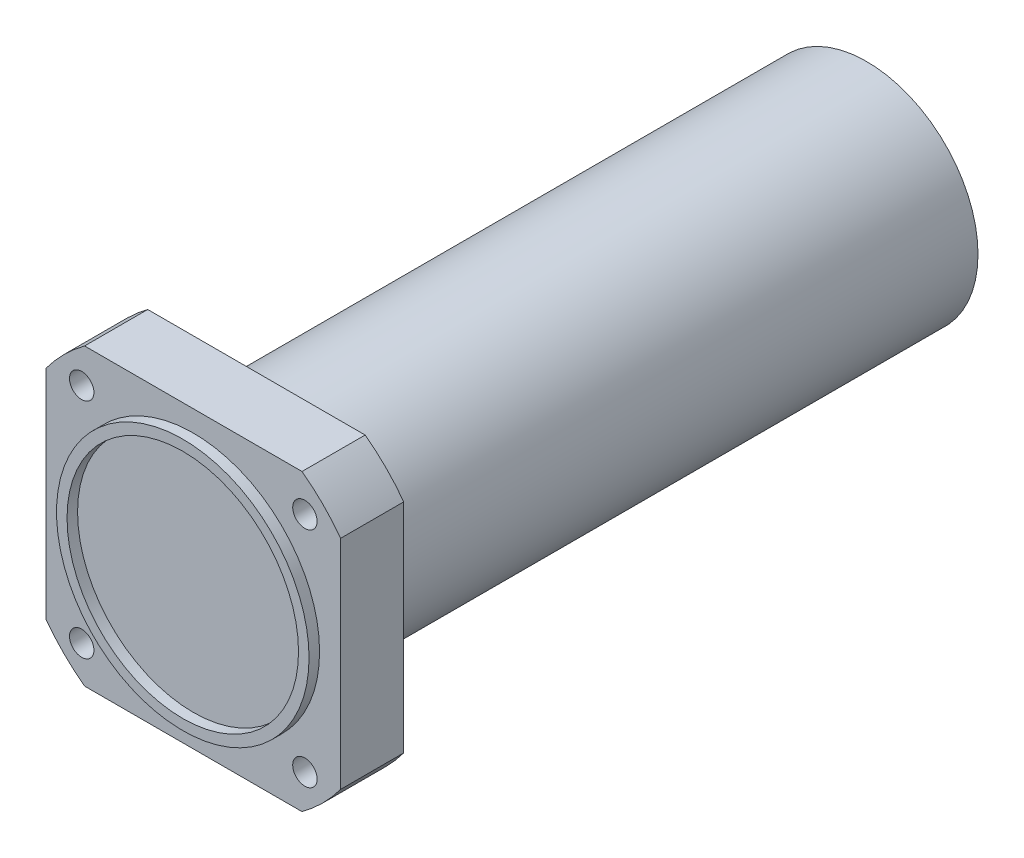
ISO-10303-21;
HEADER;
FILE_DESCRIPTION(('STEP AP214'),'2;1');
FILE_NAME('part.step','',(''),(''),'','','');
FILE_SCHEMA(('AUTOMOTIVE_DESIGN { 1 0 10303 214 1 1 1 1 }'));
ENDSEC;
DATA;
#1=APPLICATION_CONTEXT('core data for automotive mechanical design processes');
#2=APPLICATION_PROTOCOL_DEFINITION('international standard','automotive_design',2000,#1);
#3=PRODUCT_CONTEXT('',#1,'mechanical');
#4=PRODUCT('Part','Part','',(#3));
#5=PRODUCT_RELATED_PRODUCT_CATEGORY('part','',(#4));
#6=PRODUCT_DEFINITION_FORMATION('','',#4);
#7=PRODUCT_DEFINITION_CONTEXT('part definition',#1,'design');
#8=PRODUCT_DEFINITION('design','',#6,#7);
#9=PRODUCT_DEFINITION_SHAPE('','',#8);
#10=(LENGTH_UNIT() NAMED_UNIT(*) SI_UNIT(.MILLI.,.METRE.));
#11=(NAMED_UNIT(*) PLANE_ANGLE_UNIT() SI_UNIT($,.RADIAN.));
#12=(NAMED_UNIT(*) SI_UNIT($,.STERADIAN.) SOLID_ANGLE_UNIT());
#13=UNCERTAINTY_MEASURE_WITH_UNIT(LENGTH_MEASURE(1.E-05),#10,'distance_accuracy_value','');
#14=(GEOMETRIC_REPRESENTATION_CONTEXT(3) GLOBAL_UNCERTAINTY_ASSIGNED_CONTEXT((#13)) GLOBAL_UNIT_ASSIGNED_CONTEXT((#10,
#11,#12)) REPRESENTATION_CONTEXT('',''));
#15=CARTESIAN_POINT('',(0.,0.,0.));
#16=DIRECTION('',(0.,0.,1.));
#17=DIRECTION('',(1.,0.,0.));
#18=AXIS2_PLACEMENT_3D('',#15,#16,#17);
#19=CARTESIAN_POINT('',(-35.,-35.0566717378139,160.));
#20=DIRECTION('',(0.,0.,-1.));
#21=DIRECTION('',(0.,1.,0.));
#22=AXIS2_PLACEMENT_3D('',#19,#20,#21);
#23=PLANE('',#22);
#24=CARTESIAN_POINT('',(-26.5165042944955,-26.5731760323058,160.));
#25=DIRECTION('',(0.,0.,1.));
#26=DIRECTION('',(0.,-1.,0.));
#27=AXIS2_PLACEMENT_3D('',#24,#25,#26);
#28=CIRCLE('',#27,2.89999999999998);
#29=CARTESIAN_POINT('',(-26.5165042944955,-29.4731760323058,160.));
#30=VERTEX_POINT('',#29);
#31=EDGE_CURVE('E222',#30,#30,#28,.T.);
#32=ORIENTED_EDGE('',*,*,#31,.F.);
#33=EDGE_LOOP('',(#32));
#34=FACE_BOUND('',#33,.T.);
#35=CARTESIAN_POINT('',(26.5165042944958,-26.5731760323055,160.));
#36=DIRECTION('',(0.,0.,1.));
#37=DIRECTION('',(0.,-1.,0.));
#38=AXIS2_PLACEMENT_3D('',#35,#36,#37);
#39=CIRCLE('',#38,2.89999999999998);
#40=CARTESIAN_POINT('',(26.5165042944958,-29.4731760323055,160.));
#41=VERTEX_POINT('',#40);
#42=EDGE_CURVE('E216',#41,#41,#39,.T.);
#43=ORIENTED_EDGE('',*,*,#42,.F.);
#44=EDGE_LOOP('',(#43));
#45=FACE_BOUND('',#44,.T.);
#46=CARTESIAN_POINT('',(26.5165042944953,26.4598325566855,160.));
#47=DIRECTION('',(0.,0.,1.));
#48=DIRECTION('',(0.,-1.,0.));
#49=AXIS2_PLACEMENT_3D('',#46,#47,#48);
#50=CIRCLE('',#49,2.89999999999998);
#51=CARTESIAN_POINT('',(26.5165042944953,23.5598325566856,160.));
#52=VERTEX_POINT('',#51);
#53=EDGE_CURVE('E210',#52,#52,#50,.T.);
#54=ORIENTED_EDGE('',*,*,#53,.F.);
#55=EDGE_LOOP('',(#54));
#56=FACE_BOUND('',#55,.T.);
#57=CARTESIAN_POINT('',(-26.5165042944956,26.4598325566853,160.));
#58=DIRECTION('',(0.,0.,1.));
#59=DIRECTION('',(0.,-1.,0.));
#60=AXIS2_PLACEMENT_3D('',#57,#58,#59);
#61=CIRCLE('',#60,2.89999999999998);
#62=CARTESIAN_POINT('',(-26.5165042944956,23.5598325566853,160.));
#63=VERTEX_POINT('',#62);
#64=EDGE_CURVE('E204',#63,#63,#61,.T.);
#65=ORIENTED_EDGE('',*,*,#64,.F.);
#66=EDGE_LOOP('',(#65));
#67=FACE_BOUND('',#66,.T.);
#68=CARTESIAN_POINT('',(0.,-0.0566717378102238,160.));
#69=DIRECTION('',(0.,0.,1.));
#70=DIRECTION('',(1.,0.,0.));
#71=AXIS2_PLACEMENT_3D('',#68,#69,#70);
#72=CIRCLE('',#71,30.0000000000036);
#73=CARTESIAN_POINT('',(30.0000000000036,-0.0566717378102238,160.));
#74=VERTEX_POINT('',#73);
#75=EDGE_CURVE('E162',#74,#74,#72,.T.);
#76=ORIENTED_EDGE('',*,*,#75,.F.);
#77=EDGE_LOOP('',(#76));
#78=FACE_BOUND('',#77,.T.);
#79=CARTESIAN_POINT('',(0.,-0.0566717378102238,160.));
#80=DIRECTION('',(0.,0.,1.));
#81=DIRECTION('',(1.,0.,0.));
#82=AXIS2_PLACEMENT_3D('',#79,#80,#81);
#83=CIRCLE('',#82,43.5);
#84=CARTESIAN_POINT('',(-25.8311827061741,34.9433282621934,160.));
#85=VERTEX_POINT('',#84);
#86=CARTESIAN_POINT('',(-35.,25.7745109683688,160.));
#87=VERTEX_POINT('',#86);
#88=EDGE_CURVE('E97',#85,#87,#83,.T.);
#89=ORIENTED_EDGE('',*,*,#88,.T.);
#90=DIRECTION('',(0.,1.,0.));
#91=VECTOR('',#90,1.);
#92=CARTESIAN_POINT('',(-35.,-35.0566717378139,160.));
#93=LINE('',#92,#91);
#94=CARTESIAN_POINT('',(-35.,-25.8878544439892,160.));
#95=VERTEX_POINT('',#94);
#96=EDGE_CURVE('E175',#95,#87,#93,.T.);
#97=ORIENTED_EDGE('',*,*,#96,.F.);
#98=CARTESIAN_POINT('',(0.,-0.0566717378102238,160.));
#99=DIRECTION('',(0.,0.,1.));
#100=DIRECTION('',(1.,0.,0.));
#101=AXIS2_PLACEMENT_3D('',#98,#99,#100);
#102=CIRCLE('',#101,43.5);
#103=CARTESIAN_POINT('',(-25.831182706174,-35.0566717378139,160.));
#104=VERTEX_POINT('',#103);
#105=EDGE_CURVE('E154',#95,#104,#102,.T.);
#106=ORIENTED_EDGE('',*,*,#105,.T.);
#107=DIRECTION('',(1.,0.,0.));
#108=VECTOR('',#107,1.);
#109=CARTESIAN_POINT('',(-35.,-35.0566717378139,160.));
#110=LINE('',#109,#108);
#111=CARTESIAN_POINT('',(25.831182706174,-35.0566717378139,160.));
#112=VERTEX_POINT('',#111);
#113=EDGE_CURVE('E180',#104,#112,#110,.T.);
#114=ORIENTED_EDGE('',*,*,#113,.T.);
#115=CARTESIAN_POINT('',(0.,-0.0566717378102238,160.));
#116=DIRECTION('',(0.,0.,1.));
#117=DIRECTION('',(1.,0.,0.));
#118=AXIS2_PLACEMENT_3D('',#115,#116,#117);
#119=CIRCLE('',#118,43.5);
#120=CARTESIAN_POINT('',(35.,-25.8878544439892,160.));
#121=VERTEX_POINT('',#120);
#122=EDGE_CURVE('E141',#112,#121,#119,.T.);
#123=ORIENTED_EDGE('',*,*,#122,.T.);
#124=DIRECTION('',(0.,1.,0.));
#125=VECTOR('',#124,1.);
#126=CARTESIAN_POINT('',(35.,-35.0566717378139,160.));
#127=LINE('',#126,#125);
#128=CARTESIAN_POINT('',(35.,25.7745109683688,160.));
#129=VERTEX_POINT('',#128);
#130=EDGE_CURVE('E171',#121,#129,#127,.T.);
#131=ORIENTED_EDGE('',*,*,#130,.T.);
#132=CARTESIAN_POINT('',(0.,-0.0566717378102238,160.));
#133=DIRECTION('',(0.,0.,1.));
#134=DIRECTION('',(1.,0.,0.));
#135=AXIS2_PLACEMENT_3D('',#132,#133,#134);
#136=CIRCLE('',#135,43.5);
#137=CARTESIAN_POINT('',(25.8311827061741,34.9433282621934,160.));
#138=VERTEX_POINT('',#137);
#139=EDGE_CURVE('E115',#129,#138,#136,.T.);
#140=ORIENTED_EDGE('',*,*,#139,.T.);
#141=DIRECTION('',(1.,0.,0.));
#142=VECTOR('',#141,1.);
#143=CARTESIAN_POINT('',(-35.,34.9433282621934,160.));
#144=LINE('',#143,#142);
#145=EDGE_CURVE('E110',#85,#138,#144,.T.);
#146=ORIENTED_EDGE('',*,*,#145,.F.);
#147=EDGE_LOOP('',(#89,#97,#106,#114,#123,#131,#140,#146));
#148=FACE_BOUND('',#147,.T.);
#149=ADVANCED_FACE('F34',(#34,#45,#56,#67,#78,#148),#23,.F.);
#150=CARTESIAN_POINT('',(-35.,-35.0566717378138,145.));
#151=DIRECTION('',(0.,0.,-1.));
#152=DIRECTION('',(-1.,0.,0.));
#153=AXIS2_PLACEMENT_3D('',#150,#151,#152);
#154=PLANE('',#153);
#155=CARTESIAN_POINT('',(-26.5165042944955,-26.5731760323058,145.));
#156=DIRECTION('',(0.,0.,-1.));
#157=DIRECTION('',(-1.,0.,0.));
#158=AXIS2_PLACEMENT_3D('',#155,#156,#157);
#159=CIRCLE('',#158,2.89999999999997);
#160=CARTESIAN_POINT('',(-29.4165042944955,-26.5731760323058,145.));
#161=VERTEX_POINT('',#160);
#162=EDGE_CURVE('E219',#161,#161,#159,.T.);
#163=ORIENTED_EDGE('',*,*,#162,.F.);
#164=EDGE_LOOP('',(#163));
#165=FACE_BOUND('',#164,.T.);
#166=CARTESIAN_POINT('',(26.5165042944958,-26.5731760323055,145.));
#167=DIRECTION('',(0.,0.,-1.));
#168=DIRECTION('',(-1.,0.,0.));
#169=AXIS2_PLACEMENT_3D('',#166,#167,#168);
#170=CIRCLE('',#169,2.89999999999997);
#171=CARTESIAN_POINT('',(23.6165042944958,-26.5731760323055,145.));
#172=VERTEX_POINT('',#171);
#173=EDGE_CURVE('E213',#172,#172,#170,.T.);
#174=ORIENTED_EDGE('',*,*,#173,.F.);
#175=EDGE_LOOP('',(#174));
#176=FACE_BOUND('',#175,.T.);
#177=CARTESIAN_POINT('',(26.5165042944953,26.4598325566856,145.));
#178=DIRECTION('',(0.,0.,-1.));
#179=DIRECTION('',(-1.,0.,0.));
#180=AXIS2_PLACEMENT_3D('',#177,#178,#179);
#181=CIRCLE('',#180,2.89999999999997);
#182=CARTESIAN_POINT('',(23.6165042944953,26.4598325566856,145.));
#183=VERTEX_POINT('',#182);
#184=EDGE_CURVE('E207',#183,#183,#181,.T.);
#185=ORIENTED_EDGE('',*,*,#184,.F.);
#186=EDGE_LOOP('',(#185));
#187=FACE_BOUND('',#186,.T.);
#188=CARTESIAN_POINT('',(-26.5165042944956,26.4598325566853,145.));
#189=DIRECTION('',(0.,0.,-1.));
#190=DIRECTION('',(-1.,0.,0.));
#191=AXIS2_PLACEMENT_3D('',#188,#189,#190);
#192=CIRCLE('',#191,2.89999999999997);
#193=CARTESIAN_POINT('',(-29.4165042944956,26.4598325566853,145.));
#194=VERTEX_POINT('',#193);
#195=EDGE_CURVE('E105',#194,#194,#192,.T.);
#196=ORIENTED_EDGE('',*,*,#195,.F.);
#197=EDGE_LOOP('',(#196));
#198=FACE_BOUND('',#197,.T.);
#199=CARTESIAN_POINT('',(0.,-0.0566717378102238,145.));
#200=DIRECTION('',(0.,0.,1.));
#201=DIRECTION('',(1.,0.,0.));
#202=AXIS2_PLACEMENT_3D('',#199,#200,#201);
#203=CIRCLE('',#202,26.44332826219);
#204=CARTESIAN_POINT('',(26.44332826219,-0.0566717378102238,145.));
#205=VERTEX_POINT('',#204);
#206=EDGE_CURVE('E119',#205,#205,#203,.T.);
#207=ORIENTED_EDGE('',*,*,#206,.T.);
#208=EDGE_LOOP('',(#207));
#209=FACE_BOUND('',#208,.T.);
#210=DIRECTION('',(0.,1.,0.));
#211=VECTOR('',#210,1.);
#212=CARTESIAN_POINT('',(-35.,-35.0566717378138,145.));
#213=LINE('',#212,#211);
#214=CARTESIAN_POINT('',(-35.,-25.8878544439892,145.));
#215=VERTEX_POINT('',#214);
#216=CARTESIAN_POINT('',(-35.,25.7745109683687,145.));
#217=VERTEX_POINT('',#216);
#218=EDGE_CURVE('E177',#215,#217,#213,.T.);
#219=ORIENTED_EDGE('',*,*,#218,.T.);
#220=CARTESIAN_POINT('',(0.,-0.0566717378102238,145.));
#221=DIRECTION('',(0.,0.,-1.));
#222=DIRECTION('',(-1.,0.,0.));
#223=AXIS2_PLACEMENT_3D('',#220,#221,#222);
#224=CIRCLE('',#223,43.5);
#225=CARTESIAN_POINT('',(-25.8311827061741,34.9433282621934,145.));
#226=VERTEX_POINT('',#225);
#227=EDGE_CURVE('E49',#217,#226,#224,.T.);
#228=ORIENTED_EDGE('',*,*,#227,.T.);
#229=DIRECTION('',(1.,0.,0.));
#230=VECTOR('',#229,1.);
#231=CARTESIAN_POINT('',(-35.,34.9433282621934,145.));
#232=LINE('',#231,#230);
#233=CARTESIAN_POINT('',(25.8311827061741,34.9433282621934,145.));
#234=VERTEX_POINT('',#233);
#235=EDGE_CURVE('E55',#226,#234,#232,.T.);
#236=ORIENTED_EDGE('',*,*,#235,.T.);
#237=CARTESIAN_POINT('',(0.,-0.0566717378102238,145.));
#238=DIRECTION('',(0.,0.,-1.));
#239=DIRECTION('',(-1.,0.,0.));
#240=AXIS2_PLACEMENT_3D('',#237,#238,#239);
#241=CIRCLE('',#240,43.5);
#242=CARTESIAN_POINT('',(35.,25.7745109683688,145.));
#243=VERTEX_POINT('',#242);
#244=EDGE_CURVE('E137',#234,#243,#241,.T.);
#245=ORIENTED_EDGE('',*,*,#244,.T.);
#246=DIRECTION('',(0.,1.,0.));
#247=VECTOR('',#246,1.);
#248=CARTESIAN_POINT('',(35.,-35.0566717378138,145.));
#249=LINE('',#248,#247);
#250=CARTESIAN_POINT('',(35.,-25.8878544439892,145.));
#251=VERTEX_POINT('',#250);
#252=EDGE_CURVE('E173',#251,#243,#249,.T.);
#253=ORIENTED_EDGE('',*,*,#252,.F.);
#254=CARTESIAN_POINT('',(0.,-0.0566717378102238,145.));
#255=DIRECTION('',(0.,0.,-1.));
#256=DIRECTION('',(-1.,0.,0.));
#257=AXIS2_PLACEMENT_3D('',#254,#255,#256);
#258=CIRCLE('',#257,43.5);
#259=CARTESIAN_POINT('',(25.831182706174,-35.0566717378139,145.));
#260=VERTEX_POINT('',#259);
#261=EDGE_CURVE('E151',#251,#260,#258,.T.);
#262=ORIENTED_EDGE('',*,*,#261,.T.);
#263=DIRECTION('',(1.,0.,0.));
#264=VECTOR('',#263,1.);
#265=CARTESIAN_POINT('',(-35.,-35.0566717378138,145.));
#266=LINE('',#265,#264);
#267=CARTESIAN_POINT('',(-25.831182706174,-35.0566717378139,145.));
#268=VERTEX_POINT('',#267);
#269=EDGE_CURVE('E121',#268,#260,#266,.T.);
#270=ORIENTED_EDGE('',*,*,#269,.F.);
#271=CARTESIAN_POINT('',(0.,-0.0566717378102238,145.));
#272=DIRECTION('',(0.,0.,-1.));
#273=DIRECTION('',(-1.,0.,0.));
#274=AXIS2_PLACEMENT_3D('',#271,#272,#273);
#275=CIRCLE('',#274,43.5);
#276=EDGE_CURVE('E159',#268,#215,#275,.T.);
#277=ORIENTED_EDGE('',*,*,#276,.T.);
#278=EDGE_LOOP('',(#219,#228,#236,#245,#253,#262,#270,#277));
#279=FACE_BOUND('',#278,.T.);
#280=ADVANCED_FACE('F188',(#165,#176,#187,#198,#209,#279),#154,.T.);
#281=CARTESIAN_POINT('',(-35.,34.9433282621934,160.));
#282=DIRECTION('',(0.,-1.,0.));
#283=DIRECTION('',(0.,0.,-1.));
#284=AXIS2_PLACEMENT_3D('',#281,#282,#283);
#285=PLANE('',#284);
#286=DIRECTION('',(0.,0.,1.));
#287=VECTOR('',#286,1.);
#288=CARTESIAN_POINT('',(-25.8311827061741,34.9433282621934,0.));
#289=LINE('',#288,#287);
#290=EDGE_CURVE('E100',#226,#85,#289,.T.);
#291=ORIENTED_EDGE('',*,*,#290,.T.);
#292=ORIENTED_EDGE('',*,*,#145,.T.);
#293=DIRECTION('',(0.,0.,1.));
#294=VECTOR('',#293,1.);
#295=CARTESIAN_POINT('',(25.8311827061741,34.9433282621934,0.));
#296=LINE('',#295,#294);
#297=EDGE_CURVE('E42',#234,#138,#296,.T.);
#298=ORIENTED_EDGE('',*,*,#297,.F.);
#299=ORIENTED_EDGE('',*,*,#235,.F.);
#300=EDGE_LOOP('',(#291,#292,#298,#299));
#301=FACE_BOUND('',#300,.T.);
#302=ADVANCED_FACE('F108',(#301),#285,.F.);
#303=CARTESIAN_POINT('',(-35.,0.,0.));
#304=DIRECTION('',(-1.,0.,0.));
#305=DIRECTION('',(0.,0.,1.));
#306=AXIS2_PLACEMENT_3D('',#303,#304,#305);
#307=PLANE('',#306);
#308=ORIENTED_EDGE('',*,*,#96,.T.);
#309=DIRECTION('',(0.,0.,1.));
#310=VECTOR('',#309,1.);
#311=CARTESIAN_POINT('',(-35.,25.7745109683688,0.));
#312=LINE('',#311,#310);
#313=EDGE_CURVE('E11',#87,#217,#312,.F.);
#314=ORIENTED_EDGE('',*,*,#313,.T.);
#315=ORIENTED_EDGE('',*,*,#218,.F.);
#316=DIRECTION('',(0.,0.,1.));
#317=VECTOR('',#316,1.);
#318=CARTESIAN_POINT('',(-35.,-25.8878544439892,0.));
#319=LINE('',#318,#317);
#320=EDGE_CURVE('E130',#215,#95,#319,.T.);
#321=ORIENTED_EDGE('',*,*,#320,.T.);
#322=EDGE_LOOP('',(#308,#314,#315,#321));
#323=FACE_BOUND('',#322,.T.);
#324=ADVANCED_FACE('F199',(#323),#307,.T.);
#325=CARTESIAN_POINT('',(35.,0.,0.));
#326=DIRECTION('',(-1.,0.,0.));
#327=DIRECTION('',(0.,0.,1.));
#328=AXIS2_PLACEMENT_3D('',#325,#326,#327);
#329=PLANE('',#328);
#330=DIRECTION('',(0.,0.,1.));
#331=VECTOR('',#330,1.);
#332=CARTESIAN_POINT('',(35.,25.7745109683688,0.));
#333=LINE('',#332,#331);
#334=EDGE_CURVE('E138',#243,#129,#333,.T.);
#335=ORIENTED_EDGE('',*,*,#334,.T.);
#336=ORIENTED_EDGE('',*,*,#130,.F.);
#337=DIRECTION('',(0.,0.,1.));
#338=VECTOR('',#337,1.);
#339=CARTESIAN_POINT('',(35.,-25.8878544439892,0.));
#340=LINE('',#339,#338);
#341=EDGE_CURVE('E133',#251,#121,#340,.T.);
#342=ORIENTED_EDGE('',*,*,#341,.F.);
#343=ORIENTED_EDGE('',*,*,#252,.T.);
#344=EDGE_LOOP('',(#335,#336,#342,#343));
#345=FACE_BOUND('',#344,.T.);
#346=ADVANCED_FACE('F195',(#345),#329,.F.);
#347=CARTESIAN_POINT('',(-35.,-35.0566717378139,160.));
#348=DIRECTION('',(0.,-1.,0.));
#349=DIRECTION('',(0.,0.,-1.));
#350=AXIS2_PLACEMENT_3D('',#347,#348,#349);
#351=PLANE('',#350);
#352=ORIENTED_EDGE('',*,*,#269,.T.);
#353=DIRECTION('',(0.,0.,1.));
#354=VECTOR('',#353,1.);
#355=CARTESIAN_POINT('',(25.831182706174,-35.0566717378139,0.));
#356=LINE('',#355,#354);
#357=EDGE_CURVE('E144',#260,#112,#356,.T.);
#358=ORIENTED_EDGE('',*,*,#357,.T.);
#359=ORIENTED_EDGE('',*,*,#113,.F.);
#360=DIRECTION('',(0.,0.,1.));
#361=VECTOR('',#360,1.);
#362=CARTESIAN_POINT('',(-25.831182706174,-35.0566717378139,0.));
#363=LINE('',#362,#361);
#364=EDGE_CURVE('E157',#268,#104,#363,.T.);
#365=ORIENTED_EDGE('',*,*,#364,.F.);
#366=EDGE_LOOP('',(#352,#358,#359,#365));
#367=FACE_BOUND('',#366,.T.);
#368=ADVANCED_FACE('F186',(#367),#351,.T.);
#369=CARTESIAN_POINT('',(0.,-0.0566717378102238,165.890142234886));
#370=DIRECTION('',(0.,0.,1.));
#371=DIRECTION('',(1.,0.,0.));
#372=AXIS2_PLACEMENT_3D('',#369,#370,#371);
#373=CYLINDRICAL_SURFACE('',#372,26.4433282621899);
#374=ORIENTED_EDGE('',*,*,#206,.F.);
#375=EDGE_LOOP('',(#374));
#376=FACE_BOUND('',#375,.T.);
#377=CARTESIAN_POINT('',(0.,-0.0566717378102238,0.));
#378=DIRECTION('',(0.,0.,1.));
#379=DIRECTION('',(1.,0.,0.));
#380=AXIS2_PLACEMENT_3D('',#377,#378,#379);
#381=CIRCLE('',#380,26.4433282621898);
#382=CARTESIAN_POINT('',(26.4433282621898,-0.0566717378102238,0.));
#383=VERTEX_POINT('',#382);
#384=EDGE_CURVE('E116',#383,#383,#381,.T.);
#385=ORIENTED_EDGE('',*,*,#384,.T.);
#386=EDGE_LOOP('',(#385));
#387=FACE_BOUND('',#386,.T.);
#388=ADVANCED_FACE('F36',(#376,#387),#373,.T.);
#389=CARTESIAN_POINT('',(0.,0.,0.));
#390=DIRECTION('',(0.,0.,-1.));
#391=DIRECTION('',(-1.,0.,0.));
#392=AXIS2_PLACEMENT_3D('',#389,#390,#391);
#393=PLANE('',#392);
#394=ORIENTED_EDGE('',*,*,#384,.F.);
#395=EDGE_LOOP('',(#394));
#396=FACE_BOUND('',#395,.T.);
#397=ADVANCED_FACE('F254',(#396),#393,.T.);
#398=CARTESIAN_POINT('',(0.,-0.0566717378102238,165.890142234886));
#399=DIRECTION('',(0.,0.,1.));
#400=DIRECTION('',(1.,0.,0.));
#401=AXIS2_PLACEMENT_3D('',#398,#399,#400);
#402=CYLINDRICAL_SURFACE('',#401,27.5000000000036);
#403=CARTESIAN_POINT('',(0.,-0.0566717378102238,160.));
#404=DIRECTION('',(0.,0.,-1.));
#405=DIRECTION('',(0.,1.,0.));
#406=AXIS2_PLACEMENT_3D('',#403,#404,#405);
#407=CIRCLE('',#406,27.5000000000036);
#408=CARTESIAN_POINT('',(0.,27.4433282621934,160.));
#409=VERTEX_POINT('',#408);
#410=EDGE_CURVE('E127',#409,#409,#407,.T.);
#411=ORIENTED_EDGE('',*,*,#410,.T.);
#412=EDGE_LOOP('',(#411));
#413=FACE_BOUND('',#412,.T.);
#414=CARTESIAN_POINT('',(0.,-0.0566717378102238,162.5));
#415=DIRECTION('',(0.,0.,1.));
#416=DIRECTION('',(1.,0.,0.));
#417=AXIS2_PLACEMENT_3D('',#414,#415,#416);
#418=CIRCLE('',#417,27.5000000000036);
#419=CARTESIAN_POINT('',(27.5000000000036,-0.0566717378102238,162.5));
#420=VERTEX_POINT('',#419);
#421=EDGE_CURVE('E168',#420,#420,#418,.T.);
#422=ORIENTED_EDGE('',*,*,#421,.T.);
#423=EDGE_LOOP('',(#422));
#424=FACE_BOUND('',#423,.T.);
#425=ADVANCED_FACE('F248',(#413,#424),#402,.F.);
#426=CARTESIAN_POINT('',(0.,-1.80411241501588E-12,162.5));
#427=DIRECTION('',(0.,0.,-1.));
#428=DIRECTION('',(-1.,0.,0.));
#429=AXIS2_PLACEMENT_3D('',#426,#427,#428);
#430=PLANE('',#429);
#431=ORIENTED_EDGE('',*,*,#421,.F.);
#432=EDGE_LOOP('',(#431));
#433=FACE_BOUND('',#432,.T.);
#434=CARTESIAN_POINT('',(0.,-0.0566717378102238,162.5));
#435=DIRECTION('',(0.,0.,1.));
#436=DIRECTION('',(1.,0.,0.));
#437=AXIS2_PLACEMENT_3D('',#434,#435,#436);
#438=CIRCLE('',#437,30.0000000000036);
#439=CARTESIAN_POINT('',(30.0000000000036,-0.0566717378102238,162.5));
#440=VERTEX_POINT('',#439);
#441=EDGE_CURVE('E165',#440,#440,#438,.T.);
#442=ORIENTED_EDGE('',*,*,#441,.T.);
#443=EDGE_LOOP('',(#442));
#444=FACE_BOUND('',#443,.T.);
#445=ADVANCED_FACE('F243',(#433,#444),#430,.F.);
#446=CARTESIAN_POINT('',(0.,-0.0566717378102238,165.890142234886));
#447=DIRECTION('',(0.,0.,1.));
#448=DIRECTION('',(1.,0.,0.));
#449=AXIS2_PLACEMENT_3D('',#446,#447,#448);
#450=CYLINDRICAL_SURFACE('',#449,30.0000000000036);
#451=ORIENTED_EDGE('',*,*,#75,.T.);
#452=EDGE_LOOP('',(#451));
#453=FACE_BOUND('',#452,.T.);
#454=ORIENTED_EDGE('',*,*,#441,.F.);
#455=EDGE_LOOP('',(#454));
#456=FACE_BOUND('',#455,.T.);
#457=ADVANCED_FACE('F240',(#453,#456),#450,.T.);
#458=ORIENTED_EDGE('',*,*,#410,.F.);
#459=EDGE_LOOP('',(#458));
#460=FACE_BOUND('',#459,.T.);
#461=ADVANCED_FACE('F231',(#460),#23,.F.);
#462=CARTESIAN_POINT('',(0.,-0.0566717378102238,0.));
#463=DIRECTION('',(0.,0.,1.));
#464=DIRECTION('',(1.,0.,0.));
#465=AXIS2_PLACEMENT_3D('',#462,#463,#464);
#466=CYLINDRICAL_SURFACE('',#465,43.5);
#467=ORIENTED_EDGE('',*,*,#364,.T.);
#468=ORIENTED_EDGE('',*,*,#105,.F.);
#469=ORIENTED_EDGE('',*,*,#320,.F.);
#470=ORIENTED_EDGE('',*,*,#276,.F.);
#471=EDGE_LOOP('',(#467,#468,#469,#470));
#472=FACE_BOUND('',#471,.T.);
#473=ADVANCED_FACE('F197',(#472),#466,.T.);
#474=CARTESIAN_POINT('',(0.,-0.0566717378102238,0.));
#475=DIRECTION('',(0.,0.,1.));
#476=DIRECTION('',(1.,0.,0.));
#477=AXIS2_PLACEMENT_3D('',#474,#475,#476);
#478=CYLINDRICAL_SURFACE('',#477,43.5);
#479=ORIENTED_EDGE('',*,*,#341,.T.);
#480=ORIENTED_EDGE('',*,*,#122,.F.);
#481=ORIENTED_EDGE('',*,*,#357,.F.);
#482=ORIENTED_EDGE('',*,*,#261,.F.);
#483=EDGE_LOOP('',(#479,#480,#481,#482));
#484=FACE_BOUND('',#483,.T.);
#485=ADVANCED_FACE('F192',(#484),#478,.T.);
#486=CARTESIAN_POINT('',(0.,-0.0566717378102238,0.));
#487=DIRECTION('',(0.,0.,1.));
#488=DIRECTION('',(1.,0.,0.));
#489=AXIS2_PLACEMENT_3D('',#486,#487,#488);
#490=CYLINDRICAL_SURFACE('',#489,43.5);
#491=ORIENTED_EDGE('',*,*,#297,.T.);
#492=ORIENTED_EDGE('',*,*,#139,.F.);
#493=ORIENTED_EDGE('',*,*,#334,.F.);
#494=ORIENTED_EDGE('',*,*,#244,.F.);
#495=EDGE_LOOP('',(#491,#492,#493,#494));
#496=FACE_BOUND('',#495,.T.);
#497=ADVANCED_FACE('F135',(#496),#490,.T.);
#498=CARTESIAN_POINT('',(0.,-0.0566717378102238,0.));
#499=DIRECTION('',(0.,0.,1.));
#500=DIRECTION('',(1.,0.,0.));
#501=AXIS2_PLACEMENT_3D('',#498,#499,#500);
#502=CYLINDRICAL_SURFACE('',#501,43.5);
#503=ORIENTED_EDGE('',*,*,#313,.F.);
#504=ORIENTED_EDGE('',*,*,#88,.F.);
#505=ORIENTED_EDGE('',*,*,#290,.F.);
#506=ORIENTED_EDGE('',*,*,#227,.F.);
#507=EDGE_LOOP('',(#503,#504,#505,#506));
#508=FACE_BOUND('',#507,.T.);
#509=ADVANCED_FACE('F99',(#508),#502,.T.);
#510=CARTESIAN_POINT('',(-26.5165042944956,26.4598325566853,160.));
#511=DIRECTION('',(0.,0.,1.));
#512=DIRECTION('',(0.,-1.,0.));
#513=AXIS2_PLACEMENT_3D('',#510,#511,#512);
#514=CYLINDRICAL_SURFACE('',#513,2.89999999999997);
#515=ORIENTED_EDGE('',*,*,#195,.T.);
#516=EDGE_LOOP('',(#515));
#517=FACE_BOUND('',#516,.T.);
#518=ORIENTED_EDGE('',*,*,#64,.T.);
#519=EDGE_LOOP('',(#518));
#520=FACE_BOUND('',#519,.T.);
#521=ADVANCED_FACE('F319',(#517,#520),#514,.F.);
#522=CARTESIAN_POINT('',(26.5165042944953,26.4598325566855,160.));
#523=DIRECTION('',(0.,0.,1.));
#524=DIRECTION('',(0.,-1.,0.));
#525=AXIS2_PLACEMENT_3D('',#522,#523,#524);
#526=CYLINDRICAL_SURFACE('',#525,2.89999999999997);
#527=ORIENTED_EDGE('',*,*,#184,.T.);
#528=EDGE_LOOP('',(#527));
#529=FACE_BOUND('',#528,.T.);
#530=ORIENTED_EDGE('',*,*,#53,.T.);
#531=EDGE_LOOP('',(#530));
#532=FACE_BOUND('',#531,.T.);
#533=ADVANCED_FACE('F389',(#529,#532),#526,.F.);
#534=CARTESIAN_POINT('',(26.5165042944958,-26.5731760323055,160.));
#535=DIRECTION('',(0.,0.,1.));
#536=DIRECTION('',(0.,-1.,0.));
#537=AXIS2_PLACEMENT_3D('',#534,#535,#536);
#538=CYLINDRICAL_SURFACE('',#537,2.89999999999997);
#539=ORIENTED_EDGE('',*,*,#173,.T.);
#540=EDGE_LOOP('',(#539));
#541=FACE_BOUND('',#540,.T.);
#542=ORIENTED_EDGE('',*,*,#42,.T.);
#543=EDGE_LOOP('',(#542));
#544=FACE_BOUND('',#543,.T.);
#545=ADVANCED_FACE('F393',(#541,#544),#538,.F.);
#546=CARTESIAN_POINT('',(-26.5165042944955,-26.5731760323058,160.));
#547=DIRECTION('',(0.,0.,1.));
#548=DIRECTION('',(0.,-1.,0.));
#549=AXIS2_PLACEMENT_3D('',#546,#547,#548);
#550=CYLINDRICAL_SURFACE('',#549,2.89999999999997);
#551=ORIENTED_EDGE('',*,*,#162,.T.);
#552=EDGE_LOOP('',(#551));
#553=FACE_BOUND('',#552,.T.);
#554=ORIENTED_EDGE('',*,*,#31,.T.);
#555=EDGE_LOOP('',(#554));
#556=FACE_BOUND('',#555,.T.);
#557=ADVANCED_FACE('F226',(#553,#556),#550,.F.);
#558=CLOSED_SHELL('',(#149,#280,#302,#324,#346,#368,#388,#397,#425,#445,#457,#461,#473,#485,
#497,#509,#521,#533,#545,#557));
#559=MANIFOLD_SOLID_BREP('B2',#558);
#560=ADVANCED_BREP_SHAPE_REPRESENTATION('',(#18,#559),#14);
#561=SHAPE_DEFINITION_REPRESENTATION(#9,#560);
ENDSEC;
END-ISO-10303-21;
